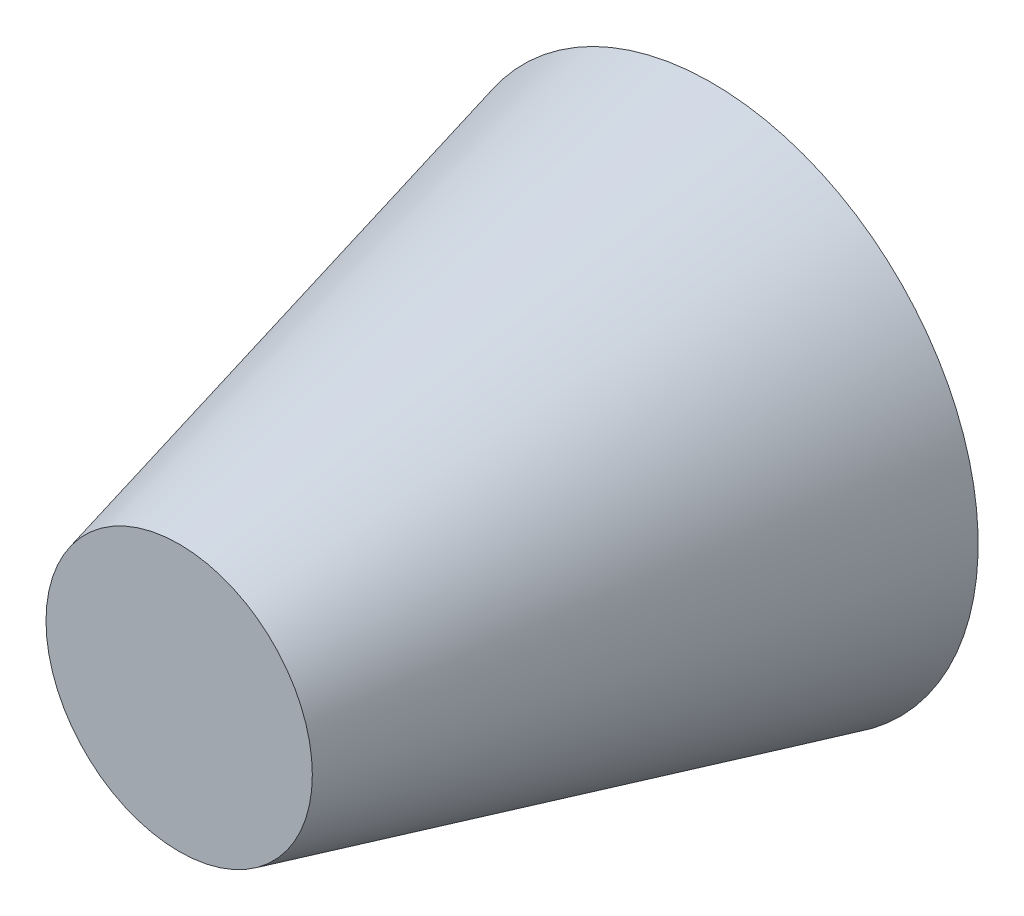
ISO-10303-21;
HEADER;
FILE_DESCRIPTION(('STEP AP214'),'2;1');
FILE_NAME('part.step','',(''),(''),'','','');
FILE_SCHEMA(('AUTOMOTIVE_DESIGN { 1 0 10303 214 1 1 1 1 }'));
ENDSEC;
DATA;
#1=APPLICATION_CONTEXT('core data for automotive mechanical design processes');
#2=APPLICATION_PROTOCOL_DEFINITION('international standard','automotive_design',2000,#1);
#3=PRODUCT_CONTEXT('',#1,'mechanical');
#4=PRODUCT('Part','Part','',(#3));
#5=PRODUCT_RELATED_PRODUCT_CATEGORY('part','',(#4));
#6=PRODUCT_DEFINITION_FORMATION('','',#4);
#7=PRODUCT_DEFINITION_CONTEXT('part definition',#1,'design');
#8=PRODUCT_DEFINITION('design','',#6,#7);
#9=PRODUCT_DEFINITION_SHAPE('','',#8);
#10=(LENGTH_UNIT() NAMED_UNIT(*) SI_UNIT(.MILLI.,.METRE.));
#11=(NAMED_UNIT(*) PLANE_ANGLE_UNIT() SI_UNIT($,.RADIAN.));
#12=(NAMED_UNIT(*) SI_UNIT($,.STERADIAN.) SOLID_ANGLE_UNIT());
#13=UNCERTAINTY_MEASURE_WITH_UNIT(LENGTH_MEASURE(1.E-05),#10,'distance_accuracy_value','');
#14=(GEOMETRIC_REPRESENTATION_CONTEXT(3) GLOBAL_UNCERTAINTY_ASSIGNED_CONTEXT((#13)) GLOBAL_UNIT_ASSIGNED_CONTEXT((#10,
#11,#12)) REPRESENTATION_CONTEXT('',''));
#15=CARTESIAN_POINT('',(0.,0.,0.));
#16=DIRECTION('',(0.,0.,1.));
#17=DIRECTION('',(1.,0.,0.));
#18=AXIS2_PLACEMENT_3D('',#15,#16,#17);
#19=CARTESIAN_POINT('',(0.,0.,0.));
#20=DIRECTION('',(0.,0.,-1.));
#21=DIRECTION('',(-1.,0.,0.));
#22=AXIS2_PLACEMENT_3D('',#19,#20,#21);
#23=PLANE('',#22);
#24=CARTESIAN_POINT('',(0.,0.,0.));
#25=DIRECTION('',(0.,0.,-1.));
#26=DIRECTION('',(-1.,0.,0.));
#27=AXIS2_PLACEMENT_3D('',#24,#25,#26);
#28=CIRCLE('',#27,10.);
#29=CARTESIAN_POINT('',(-10.,0.,0.));
#30=VERTEX_POINT('',#29);
#31=EDGE_CURVE('E10',#30,#30,#28,.T.);
#32=ORIENTED_EDGE('',*,*,#31,.T.);
#33=EDGE_LOOP('',(#32));
#34=FACE_BOUND('',#33,.T.);
#35=ADVANCED_FACE('F41',(#34),#23,.T.);
#36=CARTESIAN_POINT('',(0.,0.,0.));
#37=DIRECTION('',(0.,0.,-1.));
#38=DIRECTION('',(-1.,0.,0.));
#39=AXIS2_PLACEMENT_3D('',#36,#37,#38);
#40=CONICAL_SURFACE('',#39,10.,0.244978663126864);
#41=CARTESIAN_POINT('',(0.,0.,20.));
#42=DIRECTION('',(0.,0.,-1.));
#43=DIRECTION('',(-1.,0.,0.));
#44=AXIS2_PLACEMENT_3D('',#41,#42,#43);
#45=CIRCLE('',#44,5.);
#46=CARTESIAN_POINT('',(-5.,0.,20.));
#47=VERTEX_POINT('',#46);
#48=EDGE_CURVE('E47',#47,#47,#45,.T.);
#49=ORIENTED_EDGE('',*,*,#48,.T.);
#50=EDGE_LOOP('',(#49));
#51=FACE_BOUND('',#50,.T.);
#52=ORIENTED_EDGE('',*,*,#31,.F.);
#53=EDGE_LOOP('',(#52));
#54=FACE_BOUND('',#53,.T.);
#55=ADVANCED_FACE('F53',(#51,#54),#40,.T.);
#56=CARTESIAN_POINT('',(5.,0.,20.));
#57=DIRECTION('',(0.,0.,1.));
#58=DIRECTION('',(1.,0.,0.));
#59=AXIS2_PLACEMENT_3D('',#56,#57,#58);
#60=PLANE('',#59);
#61=ORIENTED_EDGE('',*,*,#48,.F.);
#62=EDGE_LOOP('',(#61));
#63=FACE_BOUND('',#62,.T.);
#64=ADVANCED_FACE('F56',(#63),#60,.T.);
#65=CLOSED_SHELL('',(#35,#55,#64));
#66=MANIFOLD_SOLID_BREP('B2',#65);
#67=ADVANCED_BREP_SHAPE_REPRESENTATION('',(#18,#66),#14);
#68=SHAPE_DEFINITION_REPRESENTATION(#9,#67);
ENDSEC;
END-ISO-10303-21;
